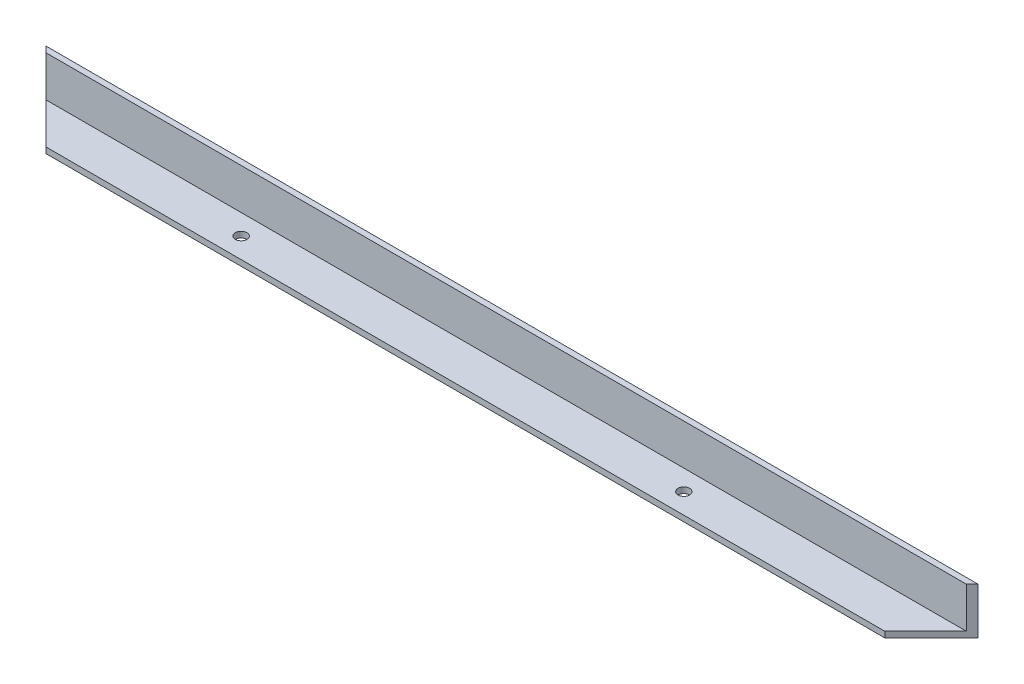
ISO-10303-21;
HEADER;
FILE_DESCRIPTION(('STEP AP214'),'2;1');
FILE_NAME('part.step','',(''),(''),'','','');
FILE_SCHEMA(('AUTOMOTIVE_DESIGN { 1 0 10303 214 1 1 1 1 }'));
ENDSEC;
DATA;
#1=APPLICATION_CONTEXT('core data for automotive mechanical design processes');
#2=APPLICATION_PROTOCOL_DEFINITION('international standard','automotive_design',2000,#1);
#3=PRODUCT_CONTEXT('',#1,'mechanical');
#4=PRODUCT('Part','Part','',(#3));
#5=PRODUCT_RELATED_PRODUCT_CATEGORY('part','',(#4));
#6=PRODUCT_DEFINITION_FORMATION('','',#4);
#7=PRODUCT_DEFINITION_CONTEXT('part definition',#1,'design');
#8=PRODUCT_DEFINITION('design','',#6,#7);
#9=PRODUCT_DEFINITION_SHAPE('','',#8);
#10=(LENGTH_UNIT() NAMED_UNIT(*) SI_UNIT(.MILLI.,.METRE.));
#11=(NAMED_UNIT(*) PLANE_ANGLE_UNIT() SI_UNIT($,.RADIAN.));
#12=(NAMED_UNIT(*) SI_UNIT($,.STERADIAN.) SOLID_ANGLE_UNIT());
#13=UNCERTAINTY_MEASURE_WITH_UNIT(LENGTH_MEASURE(1.E-05),#10,'distance_accuracy_value','');
#14=(GEOMETRIC_REPRESENTATION_CONTEXT(3) GLOBAL_UNCERTAINTY_ASSIGNED_CONTEXT((#13)) GLOBAL_UNIT_ASSIGNED_CONTEXT((#10,
#11,#12)) REPRESENTATION_CONTEXT('',''));
#15=CARTESIAN_POINT('',(0.,0.,0.));
#16=DIRECTION('',(0.,0.,1.));
#17=DIRECTION('',(1.,0.,0.));
#18=AXIS2_PLACEMENT_3D('',#15,#16,#17);
#19=CARTESIAN_POINT('',(0.,3.175,0.));
#20=DIRECTION('',(0.,-1.,0.));
#21=DIRECTION('',(0.,0.,-1.));
#22=AXIS2_PLACEMENT_3D('',#19,#20,#21);
#23=PLANE('',#22);
#24=CARTESIAN_POINT('',(-387.35,3.175,14.2875));
#25=DIRECTION('',(0.,1.,0.));
#26=DIRECTION('',(0.,0.,-1.));
#27=AXIS2_PLACEMENT_3D('',#24,#25,#26);
#28=CIRCLE('',#27,3.17499999999997);
#29=CARTESIAN_POINT('',(-387.35,3.175,11.1125));
#30=VERTEX_POINT('',#29);
#31=EDGE_CURVE('E143',#30,#30,#28,.T.);
#32=ORIENTED_EDGE('',*,*,#31,.F.);
#33=EDGE_LOOP('',(#32));
#34=FACE_BOUND('',#33,.T.);
#35=CARTESIAN_POINT('',(-146.05,3.175,14.2875));
#36=DIRECTION('',(0.,1.,0.));
#37=DIRECTION('',(0.,0.,1.));
#38=AXIS2_PLACEMENT_3D('',#35,#36,#37);
#39=CIRCLE('',#38,3.17499999999997);
#40=CARTESIAN_POINT('',(-146.05,3.175,17.4625));
#41=VERTEX_POINT('',#40);
#42=EDGE_CURVE('E154',#41,#41,#39,.T.);
#43=ORIENTED_EDGE('',*,*,#42,.F.);
#44=EDGE_LOOP('',(#43));
#45=FACE_BOUND('',#44,.T.);
#46=DIRECTION('',(1.,0.,0.));
#47=VECTOR('',#46,1.);
#48=CARTESIAN_POINT('',(-508.,3.175,3.175));
#49=LINE('',#48,#47);
#50=CARTESIAN_POINT('',(-504.825,3.175,3.175));
#51=VERTEX_POINT('',#50);
#52=CARTESIAN_POINT('',(-3.17500000000004,3.175,3.175));
#53=VERTEX_POINT('',#52);
#54=EDGE_CURVE('E105',#51,#53,#49,.T.);
#55=ORIENTED_EDGE('',*,*,#54,.F.);
#56=DIRECTION('',(0.707106781186551,0.,0.707106781186544));
#57=VECTOR('',#56,1.);
#58=CARTESIAN_POINT('',(-253.999999999997,3.175,254.));
#59=LINE('',#58,#57);
#60=CARTESIAN_POINT('',(-482.6,3.175,25.4));
#61=VERTEX_POINT('',#60);
#62=EDGE_CURVE('E141',#51,#61,#59,.T.);
#63=ORIENTED_EDGE('',*,*,#62,.T.);
#64=DIRECTION('',(1.,0.,0.));
#65=VECTOR('',#64,1.);
#66=CARTESIAN_POINT('',(0.,3.175,25.4));
#67=LINE('',#66,#65);
#68=CARTESIAN_POINT('',(-25.4000000000003,3.175,25.4));
#69=VERTEX_POINT('',#68);
#70=EDGE_CURVE('E97',#61,#69,#67,.T.);
#71=ORIENTED_EDGE('',*,*,#70,.T.);
#72=DIRECTION('',(0.707106781186551,0.,-0.707106781186544));
#73=VECTOR('',#72,1.);
#74=CARTESIAN_POINT('',(0.,3.175,0.));
#75=LINE('',#74,#73);
#76=EDGE_CURVE('E127',#69,#53,#75,.T.);
#77=ORIENTED_EDGE('',*,*,#76,.T.);
#78=EDGE_LOOP('',(#55,#63,#71,#77));
#79=FACE_BOUND('',#78,.T.);
#80=ADVANCED_FACE('F35',(#34,#45,#79),#23,.F.);
#81=CARTESIAN_POINT('',(0.,3.175,0.));
#82=DIRECTION('',(0.,0.,1.));
#83=DIRECTION('',(1.,0.,0.));
#84=AXIS2_PLACEMENT_3D('',#81,#82,#83);
#85=PLANE('',#84);
#86=DIRECTION('',(-1.,0.,0.));
#87=VECTOR('',#86,1.);
#88=CARTESIAN_POINT('',(0.,0.,0.));
#89=LINE('',#88,#87);
#90=CARTESIAN_POINT('',(0.,0.,0.));
#91=VERTEX_POINT('',#90);
#92=CARTESIAN_POINT('',(-508.,0.,0.));
#93=VERTEX_POINT('',#92);
#94=EDGE_CURVE('E96',#91,#93,#89,.T.);
#95=ORIENTED_EDGE('',*,*,#94,.T.);
#96=DIRECTION('',(0.,-1.,0.));
#97=VECTOR('',#96,1.);
#98=CARTESIAN_POINT('',(-508.,3.175,0.));
#99=LINE('',#98,#97);
#100=CARTESIAN_POINT('',(-508.,25.4,0.));
#101=VERTEX_POINT('',#100);
#102=EDGE_CURVE('E86',#101,#93,#99,.T.);
#103=ORIENTED_EDGE('',*,*,#102,.F.);
#104=DIRECTION('',(-1.,0.,0.));
#105=VECTOR('',#104,1.);
#106=CARTESIAN_POINT('',(-508.,25.4,0.));
#107=LINE('',#106,#105);
#108=CARTESIAN_POINT('',(0.,25.4,0.));
#109=VERTEX_POINT('',#108);
#110=EDGE_CURVE('E94',#109,#101,#107,.T.);
#111=ORIENTED_EDGE('',*,*,#110,.F.);
#112=DIRECTION('',(0.,-1.,0.));
#113=VECTOR('',#112,1.);
#114=CARTESIAN_POINT('',(0.,3.175,0.));
#115=LINE('',#114,#113);
#116=EDGE_CURVE('E43',#109,#91,#115,.T.);
#117=ORIENTED_EDGE('',*,*,#116,.T.);
#118=EDGE_LOOP('',(#95,#103,#111,#117));
#119=FACE_BOUND('',#118,.T.);
#120=ADVANCED_FACE('F37',(#119),#85,.F.);
#121=CARTESIAN_POINT('',(0.,3.175,25.4));
#122=DIRECTION('',(0.,0.,-1.));
#123=DIRECTION('',(-1.,0.,0.));
#124=AXIS2_PLACEMENT_3D('',#121,#122,#123);
#125=PLANE('',#124);
#126=ORIENTED_EDGE('',*,*,#70,.F.);
#127=DIRECTION('',(0.,-1.,0.));
#128=VECTOR('',#127,1.);
#129=CARTESIAN_POINT('',(-482.6,3.175,25.4));
#130=LINE('',#129,#128);
#131=CARTESIAN_POINT('',(-482.6,0.,25.4));
#132=VERTEX_POINT('',#131);
#133=EDGE_CURVE('E119',#61,#132,#130,.T.);
#134=ORIENTED_EDGE('',*,*,#133,.T.);
#135=DIRECTION('',(1.,0.,0.));
#136=VECTOR('',#135,1.);
#137=CARTESIAN_POINT('',(0.,0.,25.4));
#138=LINE('',#137,#136);
#139=CARTESIAN_POINT('',(-25.4000000000003,0.,25.4));
#140=VERTEX_POINT('',#139);
#141=EDGE_CURVE('E103',#132,#140,#138,.T.);
#142=ORIENTED_EDGE('',*,*,#141,.T.);
#143=DIRECTION('',(0.,1.,0.));
#144=VECTOR('',#143,1.);
#145=CARTESIAN_POINT('',(-25.4000000000003,3.175,25.4));
#146=LINE('',#145,#144);
#147=EDGE_CURVE('E110',#140,#69,#146,.T.);
#148=ORIENTED_EDGE('',*,*,#147,.T.);
#149=EDGE_LOOP('',(#126,#134,#142,#148));
#150=FACE_BOUND('',#149,.T.);
#151=ADVANCED_FACE('F118',(#150),#125,.F.);
#152=CARTESIAN_POINT('',(0.,0.,0.));
#153=DIRECTION('',(0.,-1.,0.));
#154=DIRECTION('',(0.,0.,-1.));
#155=AXIS2_PLACEMENT_3D('',#152,#153,#154);
#156=PLANE('',#155);
#157=DIRECTION('',(-0.707106781186551,0.,-0.707106781186544));
#158=VECTOR('',#157,1.);
#159=CARTESIAN_POINT('',(-508.,0.,0.));
#160=LINE('',#159,#158);
#161=EDGE_CURVE('E145',#132,#93,#160,.T.);
#162=ORIENTED_EDGE('',*,*,#161,.T.);
#163=ORIENTED_EDGE('',*,*,#94,.F.);
#164=DIRECTION('',(-0.707106781186551,0.,0.707106781186544));
#165=VECTOR('',#164,1.);
#166=CARTESIAN_POINT('',(0.,0.,0.));
#167=LINE('',#166,#165);
#168=EDGE_CURVE('E124',#91,#140,#167,.T.);
#169=ORIENTED_EDGE('',*,*,#168,.T.);
#170=ORIENTED_EDGE('',*,*,#141,.F.);
#171=EDGE_LOOP('',(#162,#163,#169,#170));
#172=FACE_BOUND('',#171,.T.);
#173=CARTESIAN_POINT('',(-387.35,0.,14.2875));
#174=DIRECTION('',(0.,-1.,0.));
#175=DIRECTION('',(0.,0.,-1.));
#176=AXIS2_PLACEMENT_3D('',#173,#174,#175);
#177=CIRCLE('',#176,3.17499999999997);
#178=CARTESIAN_POINT('',(-387.35,0.,11.1125));
#179=VERTEX_POINT('',#178);
#180=EDGE_CURVE('E151',#179,#179,#177,.F.);
#181=ORIENTED_EDGE('',*,*,#180,.T.);
#182=EDGE_LOOP('',(#181));
#183=FACE_BOUND('',#182,.T.);
#184=CARTESIAN_POINT('',(-146.05,0.,14.2875));
#185=DIRECTION('',(0.,-1.,0.));
#186=DIRECTION('',(0.,0.,-1.));
#187=AXIS2_PLACEMENT_3D('',#184,#185,#186);
#188=CIRCLE('',#187,3.17499999999997);
#189=CARTESIAN_POINT('',(-146.05,0.,11.1125));
#190=VERTEX_POINT('',#189);
#191=EDGE_CURVE('E134',#190,#190,#188,.F.);
#192=ORIENTED_EDGE('',*,*,#191,.T.);
#193=EDGE_LOOP('',(#192));
#194=FACE_BOUND('',#193,.T.);
#195=ADVANCED_FACE('F128',(#172,#183,#194),#156,.T.);
#196=CARTESIAN_POINT('',(-508.,25.4,3.175));
#197=DIRECTION('',(0.,0.,-1.));
#198=DIRECTION('',(-1.,0.,0.));
#199=AXIS2_PLACEMENT_3D('',#196,#197,#198);
#200=PLANE('',#199);
#201=DIRECTION('',(1.,0.,0.));
#202=VECTOR('',#201,1.);
#203=CARTESIAN_POINT('',(-508.,25.4,3.175));
#204=LINE('',#203,#202);
#205=CARTESIAN_POINT('',(-504.825,25.4,3.17499999999994));
#206=VERTEX_POINT('',#205);
#207=CARTESIAN_POINT('',(-3.17500000000004,25.4,3.175));
#208=VERTEX_POINT('',#207);
#209=EDGE_CURVE('E101',#206,#208,#204,.T.);
#210=ORIENTED_EDGE('',*,*,#209,.F.);
#211=DIRECTION('',(0.,-1.,0.));
#212=VECTOR('',#211,1.);
#213=CARTESIAN_POINT('',(-504.825,25.4,3.175));
#214=LINE('',#213,#212);
#215=EDGE_CURVE('E49',#206,#51,#214,.T.);
#216=ORIENTED_EDGE('',*,*,#215,.T.);
#217=ORIENTED_EDGE('',*,*,#54,.T.);
#218=DIRECTION('',(0.,1.,0.));
#219=VECTOR('',#218,1.);
#220=CARTESIAN_POINT('',(-3.17500000000004,25.4,3.175));
#221=LINE('',#220,#219);
#222=EDGE_CURVE('E130',#53,#208,#221,.T.);
#223=ORIENTED_EDGE('',*,*,#222,.T.);
#224=EDGE_LOOP('',(#210,#216,#217,#223));
#225=FACE_BOUND('',#224,.T.);
#226=ADVANCED_FACE('F183',(#225),#200,.F.);
#227=CARTESIAN_POINT('',(0.,25.4,0.));
#228=DIRECTION('',(0.,1.,0.));
#229=DIRECTION('',(0.,0.,1.));
#230=AXIS2_PLACEMENT_3D('',#227,#228,#229);
#231=PLANE('',#230);
#232=DIRECTION('',(-0.707106781186551,0.,-0.707106781186544));
#233=VECTOR('',#232,1.);
#234=CARTESIAN_POINT('',(-253.999999999997,25.4,254.));
#235=LINE('',#234,#233);
#236=EDGE_CURVE('E11',#206,#101,#235,.T.);
#237=ORIENTED_EDGE('',*,*,#236,.F.);
#238=ORIENTED_EDGE('',*,*,#209,.T.);
#239=DIRECTION('',(-0.707106781186551,0.,0.707106781186544));
#240=VECTOR('',#239,1.);
#241=CARTESIAN_POINT('',(0.,25.4,0.));
#242=LINE('',#241,#240);
#243=EDGE_CURVE('E100',#109,#208,#242,.T.);
#244=ORIENTED_EDGE('',*,*,#243,.F.);
#245=ORIENTED_EDGE('',*,*,#110,.T.);
#246=EDGE_LOOP('',(#237,#238,#244,#245));
#247=FACE_BOUND('',#246,.T.);
#248=ADVANCED_FACE('F99',(#247),#231,.T.);
#249=CARTESIAN_POINT('',(0.,-114.523507228448,0.));
#250=DIRECTION('',(-0.707106781186544,0.,-0.707106781186551));
#251=DIRECTION('',(-0.707106781186551,0.,0.707106781186544));
#252=AXIS2_PLACEMENT_3D('',#249,#250,#251);
#253=PLANE('',#252);
#254=ORIENTED_EDGE('',*,*,#168,.F.);
#255=ORIENTED_EDGE('',*,*,#116,.F.);
#256=ORIENTED_EDGE('',*,*,#243,.T.);
#257=ORIENTED_EDGE('',*,*,#222,.F.);
#258=ORIENTED_EDGE('',*,*,#76,.F.);
#259=ORIENTED_EDGE('',*,*,#147,.F.);
#260=EDGE_LOOP('',(#254,#255,#256,#257,#258,#259));
#261=FACE_BOUND('',#260,.T.);
#262=ADVANCED_FACE('F123',(#261),#253,.F.);
#263=CARTESIAN_POINT('',(-146.05,-8.98025612106909,14.2875));
#264=DIRECTION('',(0.,1.,0.));
#265=DIRECTION('',(0.,0.,1.));
#266=AXIS2_PLACEMENT_3D('',#263,#264,#265);
#267=CYLINDRICAL_SURFACE('',#266,3.17499999999997);
#268=ORIENTED_EDGE('',*,*,#42,.T.);
#269=EDGE_LOOP('',(#268));
#270=FACE_BOUND('',#269,.T.);
#271=ORIENTED_EDGE('',*,*,#191,.F.);
#272=EDGE_LOOP('',(#271));
#273=FACE_BOUND('',#272,.T.);
#274=ADVANCED_FACE('F160',(#270,#273),#267,.F.);
#275=CARTESIAN_POINT('',(-387.35,-8.98025612106909,14.2875));
#276=DIRECTION('',(0.,1.,0.));
#277=DIRECTION('',(0.,0.,1.));
#278=AXIS2_PLACEMENT_3D('',#275,#276,#277);
#279=CYLINDRICAL_SURFACE('',#278,3.17499999999997);
#280=ORIENTED_EDGE('',*,*,#31,.T.);
#281=EDGE_LOOP('',(#280));
#282=FACE_BOUND('',#281,.T.);
#283=ORIENTED_EDGE('',*,*,#180,.F.);
#284=EDGE_LOOP('',(#283));
#285=FACE_BOUND('',#284,.T.);
#286=ADVANCED_FACE('F162',(#282,#285),#279,.F.);
#287=CARTESIAN_POINT('',(-508.,-77.6678417992236,0.));
#288=DIRECTION('',(0.707106781186544,0.,-0.707106781186551));
#289=DIRECTION('',(-0.707106781186551,0.,-0.707106781186544));
#290=AXIS2_PLACEMENT_3D('',#287,#288,#289);
#291=PLANE('',#290);
#292=ORIENTED_EDGE('',*,*,#62,.F.);
#293=ORIENTED_EDGE('',*,*,#215,.F.);
#294=ORIENTED_EDGE('',*,*,#236,.T.);
#295=ORIENTED_EDGE('',*,*,#102,.T.);
#296=ORIENTED_EDGE('',*,*,#161,.F.);
#297=ORIENTED_EDGE('',*,*,#133,.F.);
#298=EDGE_LOOP('',(#292,#293,#294,#295,#296,#297));
#299=FACE_BOUND('',#298,.T.);
#300=ADVANCED_FACE('F85',(#299),#291,.F.);
#301=CLOSED_SHELL('',(#80,#120,#151,#195,#226,#248,#262,#274,#286,#300));
#302=MANIFOLD_SOLID_BREP('B2',#301);
#303=ADVANCED_BREP_SHAPE_REPRESENTATION('',(#18,#302),#14);
#304=SHAPE_DEFINITION_REPRESENTATION(#9,#303);
ENDSEC;
END-ISO-10303-21;
